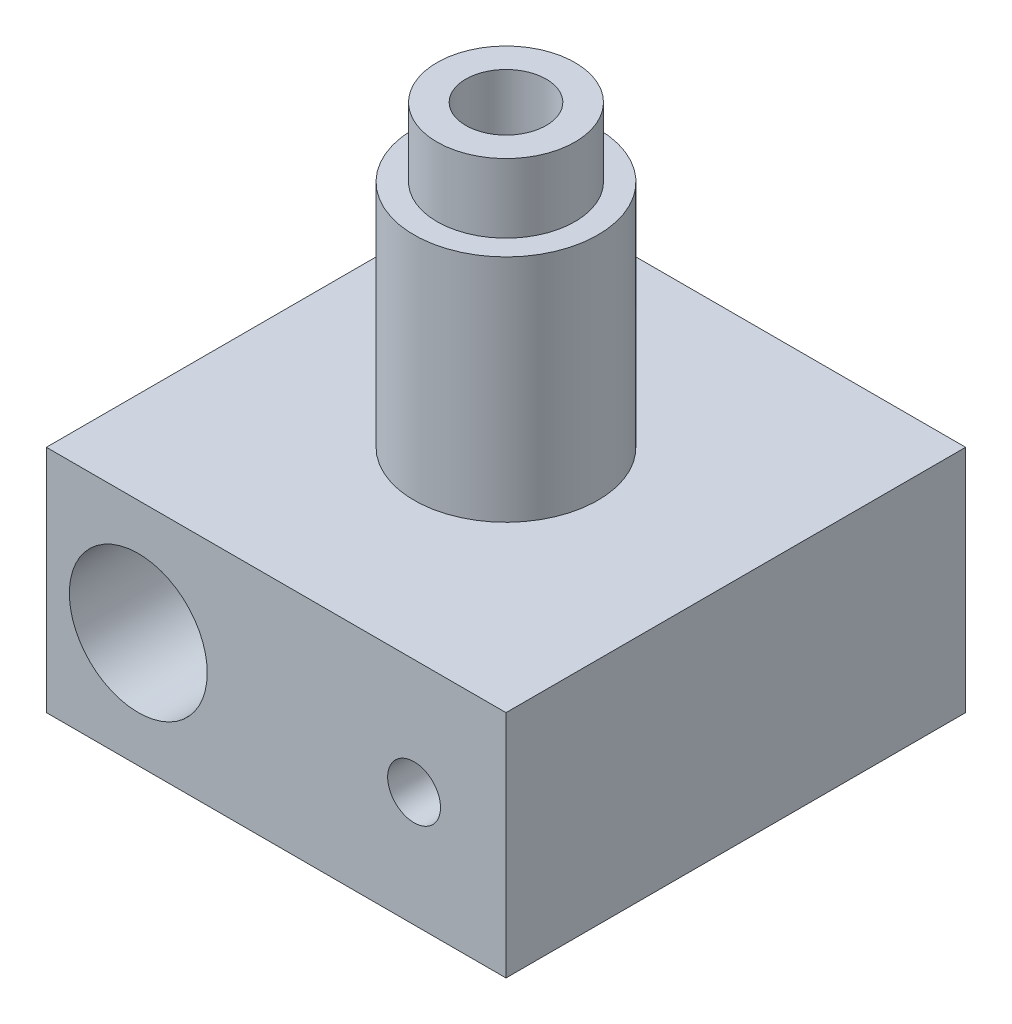
ISO-10303-21;
HEADER;
FILE_DESCRIPTION(('STEP AP214'),'2;1');
FILE_NAME('part.step','',(''),(''),'','','');
FILE_SCHEMA(('AUTOMOTIVE_DESIGN { 1 0 10303 214 1 1 1 1 }'));
ENDSEC;
DATA;
#1=APPLICATION_CONTEXT('core data for automotive mechanical design processes');
#2=APPLICATION_PROTOCOL_DEFINITION('international standard','automotive_design',2000,#1);
#3=PRODUCT_CONTEXT('',#1,'mechanical');
#4=PRODUCT('Part','Part','',(#3));
#5=PRODUCT_RELATED_PRODUCT_CATEGORY('part','',(#4));
#6=PRODUCT_DEFINITION_FORMATION('','',#4);
#7=PRODUCT_DEFINITION_CONTEXT('part definition',#1,'design');
#8=PRODUCT_DEFINITION('design','',#6,#7);
#9=PRODUCT_DEFINITION_SHAPE('','',#8);
#10=(LENGTH_UNIT() NAMED_UNIT(*) SI_UNIT(.MILLI.,.METRE.));
#11=(NAMED_UNIT(*) PLANE_ANGLE_UNIT() SI_UNIT($,.RADIAN.));
#12=(NAMED_UNIT(*) SI_UNIT($,.STERADIAN.) SOLID_ANGLE_UNIT());
#13=UNCERTAINTY_MEASURE_WITH_UNIT(LENGTH_MEASURE(1.E-05),#10,'distance_accuracy_value','');
#14=(GEOMETRIC_REPRESENTATION_CONTEXT(3) GLOBAL_UNCERTAINTY_ASSIGNED_CONTEXT((#13)) GLOBAL_UNIT_ASSIGNED_CONTEXT((#10,
#11,#12)) REPRESENTATION_CONTEXT('',''));
#15=CARTESIAN_POINT('',(0.,0.,0.));
#16=DIRECTION('',(0.,0.,1.));
#17=DIRECTION('',(1.,0.,0.));
#18=AXIS2_PLACEMENT_3D('',#15,#16,#17);
#19=CARTESIAN_POINT('',(0.,23.,0.));
#20=DIRECTION('',(0.,1.,0.));
#21=DIRECTION('',(0.,0.,1.));
#22=AXIS2_PLACEMENT_3D('',#19,#20,#21);
#23=PLANE('',#22);
#24=CARTESIAN_POINT('',(0.,23.,0.));
#25=DIRECTION('',(0.,1.,0.));
#26=DIRECTION('',(1.,0.,0.));
#27=AXIS2_PLACEMENT_3D('',#24,#25,#26);
#28=CIRCLE('',#27,1.75);
#29=CARTESIAN_POINT('',(0.,23.,-1.75));
#30=VERTEX_POINT('',#29);
#31=EDGE_CURVE('E162',#30,#30,#28,.T.);
#32=ORIENTED_EDGE('',*,*,#31,.F.);
#33=EDGE_LOOP('',(#32));
#34=FACE_BOUND('',#33,.T.);
#35=CARTESIAN_POINT('',(0.,23.,0.));
#36=DIRECTION('',(0.,1.,0.));
#37=DIRECTION('',(0.,0.,1.));
#38=AXIS2_PLACEMENT_3D('',#35,#36,#37);
#39=CIRCLE('',#38,3.);
#40=CARTESIAN_POINT('',(0.,23.,3.));
#41=VERTEX_POINT('',#40);
#42=EDGE_CURVE('E239',#41,#41,#39,.T.);
#43=ORIENTED_EDGE('',*,*,#42,.T.);
#44=EDGE_LOOP('',(#43));
#45=FACE_BOUND('',#44,.T.);
#46=ADVANCED_FACE('F47',(#34,#45),#23,.T.);
#47=CARTESIAN_POINT('',(0.,23.,0.));
#48=DIRECTION('',(0.,-1.,0.));
#49=DIRECTION('',(0.,0.,-1.));
#50=AXIS2_PLACEMENT_3D('',#47,#48,#49);
#51=CYLINDRICAL_SURFACE('',#50,4.);
#52=CARTESIAN_POINT('',(0.,10.,0.));
#53=DIRECTION('',(0.,1.,0.));
#54=DIRECTION('',(0.,0.,1.));
#55=AXIS2_PLACEMENT_3D('',#52,#53,#54);
#56=CIRCLE('',#55,4.);
#57=CARTESIAN_POINT('',(0.,10.,-4.));
#58=VERTEX_POINT('',#57);
#59=EDGE_CURVE('E165',#58,#58,#56,.T.);
#60=CARTESIAN_POINT('',(0.,20.,0.));
#61=DIRECTION('',(0.,1.,0.));
#62=DIRECTION('',(0.,0.,1.));
#63=AXIS2_PLACEMENT_3D('',#60,#61,#62);
#64=CIRCLE('',#63,4.);
#65=CARTESIAN_POINT('',(0.,20.,-4.));
#66=VERTEX_POINT('',#65);
#67=EDGE_CURVE('E51',#66,#66,#64,.T.);
#68=CARTESIAN_POINT('',(0.,10.,-4.));
#69=CARTESIAN_POINT('',(0.,10.1041666666667,-4.));
#70=CARTESIAN_POINT('',(0.,10.2083333333333,-4.));
#71=CARTESIAN_POINT('',(0.,10.4166666666667,-4.));
#72=CARTESIAN_POINT('',(0.,10.5208333333333,-4.));
#73=CARTESIAN_POINT('',(0.,10.7291666666667,-4.));
#74=CARTESIAN_POINT('',(0.,10.8333333333333,-4.));
#75=CARTESIAN_POINT('',(0.,11.0416666666667,-4.));
#76=CARTESIAN_POINT('',(0.,11.1458333333333,-4.));
#77=CARTESIAN_POINT('',(0.,11.3541666666667,-4.));
#78=CARTESIAN_POINT('',(0.,11.4583333333333,-4.));
#79=CARTESIAN_POINT('',(0.,11.6666666666667,-4.));
#80=CARTESIAN_POINT('',(0.,11.7708333333333,-4.));
#81=CARTESIAN_POINT('',(0.,11.9791666666667,-4.));
#82=CARTESIAN_POINT('',(0.,12.0833333333333,-4.));
#83=CARTESIAN_POINT('',(0.,12.2916666666667,-4.));
#84=CARTESIAN_POINT('',(0.,12.3958333333333,-4.));
#85=CARTESIAN_POINT('',(0.,12.6041666666667,-4.));
#86=CARTESIAN_POINT('',(0.,12.7083333333333,-4.));
#87=CARTESIAN_POINT('',(0.,12.9166666666667,-4.));
#88=CARTESIAN_POINT('',(0.,13.0208333333333,-4.));
#89=CARTESIAN_POINT('',(0.,13.2291666666667,-4.));
#90=CARTESIAN_POINT('',(0.,13.3333333333333,-4.));
#91=CARTESIAN_POINT('',(0.,13.5416666666667,-4.));
#92=CARTESIAN_POINT('',(0.,13.6458333333333,-4.));
#93=CARTESIAN_POINT('',(0.,13.8541666666667,-4.));
#94=CARTESIAN_POINT('',(0.,13.9583333333333,-4.));
#95=CARTESIAN_POINT('',(0.,14.1666666666667,-4.));
#96=CARTESIAN_POINT('',(0.,14.2708333333333,-4.));
#97=CARTESIAN_POINT('',(0.,14.4791666666667,-4.));
#98=CARTESIAN_POINT('',(0.,14.5833333333333,-4.));
#99=CARTESIAN_POINT('',(0.,14.7916666666667,-4.));
#100=CARTESIAN_POINT('',(0.,14.8958333333333,-4.));
#101=CARTESIAN_POINT('',(0.,15.1041666666667,-4.));
#102=CARTESIAN_POINT('',(0.,15.2083333333333,-4.));
#103=CARTESIAN_POINT('',(0.,15.4166666666667,-4.));
#104=CARTESIAN_POINT('',(0.,15.5208333333333,-4.));
#105=CARTESIAN_POINT('',(0.,15.7291666666667,-4.));
#106=CARTESIAN_POINT('',(0.,15.8333333333333,-4.));
#107=CARTESIAN_POINT('',(0.,16.0416666666667,-4.));
#108=CARTESIAN_POINT('',(0.,16.1458333333333,-4.));
#109=CARTESIAN_POINT('',(0.,16.3541666666667,-4.));
#110=CARTESIAN_POINT('',(0.,16.4583333333333,-4.));
#111=CARTESIAN_POINT('',(0.,16.6666666666667,-4.));
#112=CARTESIAN_POINT('',(0.,16.7708333333333,-4.));
#113=CARTESIAN_POINT('',(0.,16.9791666666667,-4.));
#114=CARTESIAN_POINT('',(0.,17.0833333333333,-4.));
#115=CARTESIAN_POINT('',(0.,17.2916666666667,-4.));
#116=CARTESIAN_POINT('',(0.,17.3958333333333,-4.));
#117=CARTESIAN_POINT('',(0.,17.6041666666667,-4.));
#118=CARTESIAN_POINT('',(0.,17.7083333333333,-4.));
#119=CARTESIAN_POINT('',(0.,17.9166666666667,-4.));
#120=CARTESIAN_POINT('',(0.,18.0208333333333,-4.));
#121=CARTESIAN_POINT('',(0.,18.2291666666667,-4.));
#122=CARTESIAN_POINT('',(0.,18.3333333333333,-4.));
#123=CARTESIAN_POINT('',(0.,18.5416666666667,-4.));
#124=CARTESIAN_POINT('',(0.,18.6458333333333,-4.));
#125=CARTESIAN_POINT('',(0.,18.8541666666667,-4.));
#126=CARTESIAN_POINT('',(0.,18.9583333333333,-4.));
#127=CARTESIAN_POINT('',(0.,19.1666666666667,-4.));
#128=CARTESIAN_POINT('',(0.,19.2708333333333,-4.));
#129=CARTESIAN_POINT('',(0.,19.4791666666667,-4.));
#130=CARTESIAN_POINT('',(0.,19.5833333333333,-4.));
#131=CARTESIAN_POINT('',(0.,19.7916666666667,-4.));
#132=CARTESIAN_POINT('',(0.,19.8958333333333,-4.));
#133=CARTESIAN_POINT('',(0.,20.,-4.));
#134=B_SPLINE_CURVE_WITH_KNOTS('',3,(#68,#69,#70,#71,#72,#73,#74,#75,#76,#77,#78,#79,#80,#81,
#82,#83,#84,#85,#86,#87,#88,#89,#90,#91,#92,#93,#94,#95,#96,#97,#98,#99,#100,#101,#102,#103,
#104,#105,#106,#107,#108,#109,#110,#111,#112,#113,#114,#115,#116,#117,#118,#119,#120,#121,#122,
#123,#124,#125,#126,#127,#128,#129,#130,#131,#132,#133),.UNSPECIFIED.,.F.,.F.,(4,2,2,2,2,2,2,2,
2,2,2,2,2,2,2,2,2,2,2,2,2,2,2,2,2,2,2,2,2,2,2,2,4),(0.,0.3125,0.625000000000001,
0.937500000000001,1.25,1.5625,1.875,2.1875,2.5,2.8125,3.125,3.4375,3.75,4.0625,4.375,4.6875,5.,
5.3125,5.625,5.9375,6.25,6.5625,6.875,7.1875,7.5,7.8125,8.125,8.4375,8.75,9.0625,9.375,9.6875,
10.),.UNSPECIFIED.);
#135=EDGE_CURVE('BSEAM190',#58,#66,#134,.T.);
#136=ORIENTED_EDGE('',*,*,#59,.T.);
#137=ORIENTED_EDGE('',*,*,#67,.F.);
#138=ORIENTED_EDGE('',*,*,#135,.T.);
#139=ORIENTED_EDGE('',*,*,#135,.F.);
#140=EDGE_LOOP('',(#136,#138,#137,#139));
#141=FACE_BOUND('',#140,.T.);
#142=ADVANCED_FACE('F190',(#141),#51,.T.);
#143=CARTESIAN_POINT('',(0.,10.,0.));
#144=DIRECTION('',(0.,1.,0.));
#145=DIRECTION('',(0.,0.,1.));
#146=AXIS2_PLACEMENT_3D('',#143,#144,#145);
#147=PLANE('',#146);
#148=DIRECTION('',(0.,0.,1.));
#149=VECTOR('',#148,1.);
#150=CARTESIAN_POINT('',(-10.,10.,10.));
#151=LINE('',#150,#149);
#152=CARTESIAN_POINT('',(-10.,10.,-10.));
#153=VERTEX_POINT('',#152);
#154=CARTESIAN_POINT('',(-10.,10.,10.));
#155=VERTEX_POINT('',#154);
#156=EDGE_CURVE('E103',#153,#155,#151,.T.);
#157=ORIENTED_EDGE('',*,*,#156,.T.);
#158=DIRECTION('',(1.,0.,0.));
#159=VECTOR('',#158,1.);
#160=CARTESIAN_POINT('',(10.,10.,10.));
#161=LINE('',#160,#159);
#162=CARTESIAN_POINT('',(10.,10.,10.));
#163=VERTEX_POINT('',#162);
#164=EDGE_CURVE('E97',#155,#163,#161,.T.);
#165=ORIENTED_EDGE('',*,*,#164,.T.);
#166=DIRECTION('',(0.,0.,-1.));
#167=VECTOR('',#166,1.);
#168=CARTESIAN_POINT('',(10.,10.,10.));
#169=LINE('',#168,#167);
#170=CARTESIAN_POINT('',(10.,10.,-10.));
#171=VERTEX_POINT('',#170);
#172=EDGE_CURVE('E101',#163,#171,#169,.T.);
#173=ORIENTED_EDGE('',*,*,#172,.T.);
#174=DIRECTION('',(-1.,0.,0.));
#175=VECTOR('',#174,1.);
#176=CARTESIAN_POINT('',(10.,10.,-10.));
#177=LINE('',#176,#175);
#178=EDGE_CURVE('E66',#171,#153,#177,.T.);
#179=ORIENTED_EDGE('',*,*,#178,.T.);
#180=EDGE_LOOP('',(#157,#165,#173,#179));
#181=FACE_BOUND('',#180,.T.);
#182=ORIENTED_EDGE('',*,*,#59,.F.);
#183=EDGE_LOOP('',(#182));
#184=FACE_BOUND('',#183,.T.);
#185=ADVANCED_FACE('F98',(#181,#184),#147,.T.);
#186=CARTESIAN_POINT('',(0.,-26.5281717356203,0.));
#187=DIRECTION('',(0.,-1.,0.));
#188=DIRECTION('',(0.,0.,-1.));
#189=AXIS2_PLACEMENT_3D('',#186,#187,#188);
#190=CYLINDRICAL_SURFACE('',#189,0.15);
#191=CARTESIAN_POINT('',(0.,-5.,0.));
#192=DIRECTION('',(0.,-1.,0.));
#193=DIRECTION('',(0.,0.,-1.));
#194=AXIS2_PLACEMENT_3D('',#191,#192,#193);
#195=CIRCLE('',#194,0.149999999999999);
#196=CARTESIAN_POINT('',(0.,-5.,-0.149999999999999));
#197=VERTEX_POINT('',#196);
#198=EDGE_CURVE('E57',#197,#197,#195,.T.);
#199=ORIENTED_EDGE('',*,*,#198,.T.);
#200=EDGE_LOOP('',(#199));
#201=FACE_BOUND('',#200,.T.);
#202=CARTESIAN_POINT('',(0.,10.,0.));
#203=DIRECTION('',(0.,1.,0.));
#204=DIRECTION('',(0.,0.,1.));
#205=AXIS2_PLACEMENT_3D('',#202,#203,#204);
#206=CIRCLE('',#205,0.150000000000001);
#207=CARTESIAN_POINT('',(0.,10.,0.150000000000001));
#208=VERTEX_POINT('',#207);
#209=EDGE_CURVE('E121',#208,#208,#206,.T.);
#210=ORIENTED_EDGE('',*,*,#209,.T.);
#211=EDGE_LOOP('',(#210));
#212=FACE_BOUND('',#211,.T.);
#213=ADVANCED_FACE('F49',(#201,#212),#190,.F.);
#214=CARTESIAN_POINT('',(-0.149999999999999,-5.,0.));
#215=DIRECTION('',(0.,1.,0.));
#216=DIRECTION('',(0.,0.,1.));
#217=AXIS2_PLACEMENT_3D('',#214,#215,#216);
#218=PLANE('',#217);
#219=ORIENTED_EDGE('',*,*,#198,.F.);
#220=EDGE_LOOP('',(#219));
#221=FACE_BOUND('',#220,.T.);
#222=CARTESIAN_POINT('',(0.,-5.,0.));
#223=DIRECTION('',(0.,-1.,0.));
#224=DIRECTION('',(0.,0.,-1.));
#225=AXIS2_PLACEMENT_3D('',#222,#223,#224);
#226=CIRCLE('',#225,0.5);
#227=CARTESIAN_POINT('',(0.,-5.,0.5));
#228=VERTEX_POINT('',#227);
#229=EDGE_CURVE('E134',#228,#228,#226,.T.);
#230=ORIENTED_EDGE('',*,*,#229,.T.);
#231=EDGE_LOOP('',(#230));
#232=FACE_BOUND('',#231,.T.);
#233=ADVANCED_FACE('F268',(#221,#232),#218,.F.);
#234=CARTESIAN_POINT('',(0.,-2.,0.));
#235=DIRECTION('',(0.,1.,0.));
#236=DIRECTION('',(0.,0.,1.));
#237=AXIS2_PLACEMENT_3D('',#234,#235,#236);
#238=CONICAL_SURFACE('',#237,3.,0.694738276196703);
#239=CARTESIAN_POINT('',(0.,-2.,0.));
#240=DIRECTION('',(0.,-1.,0.));
#241=DIRECTION('',(0.,0.,-1.));
#242=AXIS2_PLACEMENT_3D('',#239,#240,#241);
#243=CIRCLE('',#242,3.);
#244=CARTESIAN_POINT('',(0.,-2.,3.));
#245=VERTEX_POINT('',#244);
#246=EDGE_CURVE('E131',#245,#245,#243,.T.);
#247=CARTESIAN_POINT('',(0.,-5.,0.5));
#248=CARTESIAN_POINT('',(0.,-4.96875,0.526041666666667));
#249=CARTESIAN_POINT('',(0.,-4.9375,0.552083333333334));
#250=CARTESIAN_POINT('',(0.,-4.875,0.604166666666667));
#251=CARTESIAN_POINT('',(0.,-4.84375,0.630208333333334));
#252=CARTESIAN_POINT('',(0.,-4.78125,0.682291666666667));
#253=CARTESIAN_POINT('',(0.,-4.75,0.708333333333333));
#254=CARTESIAN_POINT('',(0.,-4.6875,0.760416666666667));
#255=CARTESIAN_POINT('',(0.,-4.65625,0.786458333333334));
#256=CARTESIAN_POINT('',(0.,-4.59375,0.838541666666667));
#257=CARTESIAN_POINT('',(0.,-4.5625,0.864583333333334));
#258=CARTESIAN_POINT('',(0.,-4.5,0.916666666666667));
#259=CARTESIAN_POINT('',(0.,-4.46875,0.942708333333334));
#260=CARTESIAN_POINT('',(0.,-4.40625,0.994791666666667));
#261=CARTESIAN_POINT('',(0.,-4.375,1.02083333333333));
#262=CARTESIAN_POINT('',(0.,-4.3125,1.07291666666667));
#263=CARTESIAN_POINT('',(0.,-4.28125,1.09895833333333));
#264=CARTESIAN_POINT('',(0.,-4.21875,1.15104166666667));
#265=CARTESIAN_POINT('',(0.,-4.1875,1.17708333333333));
#266=CARTESIAN_POINT('',(0.,-4.125,1.22916666666667));
#267=CARTESIAN_POINT('',(0.,-4.09375,1.25520833333333));
#268=CARTESIAN_POINT('',(0.,-4.03125,1.30729166666667));
#269=CARTESIAN_POINT('',(0.,-4.,1.33333333333333));
#270=CARTESIAN_POINT('',(0.,-3.9375,1.38541666666667));
#271=CARTESIAN_POINT('',(0.,-3.90625,1.41145833333333));
#272=CARTESIAN_POINT('',(0.,-3.84375,1.46354166666667));
#273=CARTESIAN_POINT('',(0.,-3.8125,1.48958333333333));
#274=CARTESIAN_POINT('',(0.,-3.75,1.54166666666667));
#275=CARTESIAN_POINT('',(0.,-3.71875,1.56770833333333));
#276=CARTESIAN_POINT('',(0.,-3.65625,1.61979166666667));
#277=CARTESIAN_POINT('',(0.,-3.625,1.64583333333333));
#278=CARTESIAN_POINT('',(0.,-3.5625,1.69791666666667));
#279=CARTESIAN_POINT('',(0.,-3.53125,1.72395833333333));
#280=CARTESIAN_POINT('',(0.,-3.46875,1.77604166666667));
#281=CARTESIAN_POINT('',(0.,-3.4375,1.80208333333333));
#282=CARTESIAN_POINT('',(0.,-3.375,1.85416666666667));
#283=CARTESIAN_POINT('',(0.,-3.34375,1.88020833333333));
#284=CARTESIAN_POINT('',(0.,-3.28125,1.93229166666667));
#285=CARTESIAN_POINT('',(0.,-3.25,1.95833333333333));
#286=CARTESIAN_POINT('',(0.,-3.1875,2.01041666666667));
#287=CARTESIAN_POINT('',(0.,-3.15625,2.03645833333333));
#288=CARTESIAN_POINT('',(0.,-3.09375,2.08854166666667));
#289=CARTESIAN_POINT('',(0.,-3.0625,2.11458333333333));
#290=CARTESIAN_POINT('',(0.,-3.,2.16666666666667));
#291=CARTESIAN_POINT('',(0.,-2.96875,2.19270833333333));
#292=CARTESIAN_POINT('',(0.,-2.90625,2.24479166666667));
#293=CARTESIAN_POINT('',(0.,-2.875,2.27083333333333));
#294=CARTESIAN_POINT('',(0.,-2.8125,2.32291666666667));
#295=CARTESIAN_POINT('',(0.,-2.78125,2.34895833333333));
#296=CARTESIAN_POINT('',(0.,-2.71875,2.40104166666667));
#297=CARTESIAN_POINT('',(0.,-2.6875,2.42708333333333));
#298=CARTESIAN_POINT('',(0.,-2.625,2.47916666666667));
#299=CARTESIAN_POINT('',(0.,-2.59375,2.50520833333333));
#300=CARTESIAN_POINT('',(0.,-2.53125,2.55729166666667));
#301=CARTESIAN_POINT('',(0.,-2.5,2.58333333333333));
#302=CARTESIAN_POINT('',(0.,-2.4375,2.63541666666667));
#303=CARTESIAN_POINT('',(0.,-2.40625,2.66145833333333));
#304=CARTESIAN_POINT('',(0.,-2.34375,2.71354166666667));
#305=CARTESIAN_POINT('',(0.,-2.3125,2.73958333333333));
#306=CARTESIAN_POINT('',(0.,-2.25,2.79166666666667));
#307=CARTESIAN_POINT('',(0.,-2.21875,2.81770833333333));
#308=CARTESIAN_POINT('',(0.,-2.15625,2.86979166666667));
#309=CARTESIAN_POINT('',(0.,-2.125,2.89583333333333));
#310=CARTESIAN_POINT('',(0.,-2.0625,2.94791666666667));
#311=CARTESIAN_POINT('',(0.,-2.03125,2.97395833333333));
#312=CARTESIAN_POINT('',(0.,-2.,3.));
#313=B_SPLINE_CURVE_WITH_KNOTS('',3,(#247,#248,#249,#250,#251,#252,#253,#254,#255,#256,#257,
#258,#259,#260,#261,#262,#263,#264,#265,#266,#267,#268,#269,#270,#271,#272,#273,#274,#275,#276,
#277,#278,#279,#280,#281,#282,#283,#284,#285,#286,#287,#288,#289,#290,#291,#292,#293,#294,#295,
#296,#297,#298,#299,#300,#301,#302,#303,#304,#305,#306,#307,#308,#309,#310,#311,#312),
.UNSPECIFIED.,.F.,.F.,(4,2,2,2,2,2,2,2,2,2,2,2,2,2,2,2,2,2,2,2,2,2,2,2,2,2,2,2,2,2,2,2,4),(0.,
0.122035151186042,0.244070302372082,0.366105453558124,0.488140604744165,0.610175755930207,
0.732210907116249,0.85424605830229,0.976281209488332,1.09831636067437,1.22035151186041,
1.34238666304646,1.4644218142325,1.58645696541854,1.70849211660458,1.83052726779062,
1.95256241897666,2.0745975701627,2.19663272134874,2.31866787253479,2.44070302372083,
2.56273817490687,2.68477332609291,2.80680847727895,2.92884362846499,3.05087877965103,
3.17291393083708,3.29494908202312,3.41698423320916,3.5390193843952,3.66105453558124,
3.78308968676728,3.90512483795332),.UNSPECIFIED.);
#314=EDGE_CURVE('BSEAM265',#228,#245,#313,.T.);
#315=ORIENTED_EDGE('',*,*,#229,.F.);
#316=ORIENTED_EDGE('',*,*,#246,.T.);
#317=ORIENTED_EDGE('',*,*,#314,.T.);
#318=ORIENTED_EDGE('',*,*,#314,.F.);
#319=EDGE_LOOP('',(#315,#317,#316,#318));
#320=FACE_BOUND('',#319,.T.);
#321=ADVANCED_FACE('F265',(#320),#238,.T.);
#322=CARTESIAN_POINT('',(0.,-26.5281717356203,0.));
#323=DIRECTION('',(0.,-1.,0.));
#324=DIRECTION('',(0.,0.,-1.));
#325=AXIS2_PLACEMENT_3D('',#322,#323,#324);
#326=CYLINDRICAL_SURFACE('',#325,3.);
#327=ORIENTED_EDGE('',*,*,#246,.F.);
#328=EDGE_LOOP('',(#327));
#329=FACE_BOUND('',#328,.T.);
#330=CARTESIAN_POINT('',(0.,0.,0.));
#331=DIRECTION('',(0.,1.,0.));
#332=DIRECTION('',(0.,0.,1.));
#333=AXIS2_PLACEMENT_3D('',#330,#331,#332);
#334=CIRCLE('',#333,3.);
#335=CARTESIAN_POINT('',(0.,0.,3.));
#336=VERTEX_POINT('',#335);
#337=EDGE_CURVE('E128',#336,#336,#334,.T.);
#338=ORIENTED_EDGE('',*,*,#337,.F.);
#339=EDGE_LOOP('',(#338));
#340=FACE_BOUND('',#339,.T.);
#341=ADVANCED_FACE('F184',(#329,#340),#326,.T.);
#342=CARTESIAN_POINT('',(0.,0.,0.));
#343=DIRECTION('',(0.,1.,0.));
#344=DIRECTION('',(0.,0.,1.));
#345=AXIS2_PLACEMENT_3D('',#342,#343,#344);
#346=PLANE('',#345);
#347=DIRECTION('',(0.,0.,1.));
#348=VECTOR('',#347,1.);
#349=CARTESIAN_POINT('',(-10.,0.,10.));
#350=LINE('',#349,#348);
#351=CARTESIAN_POINT('',(-10.,0.,-10.));
#352=VERTEX_POINT('',#351);
#353=CARTESIAN_POINT('',(-10.,0.,10.));
#354=VERTEX_POINT('',#353);
#355=EDGE_CURVE('E118',#352,#354,#350,.T.);
#356=ORIENTED_EDGE('',*,*,#355,.F.);
#357=DIRECTION('',(-1.,0.,0.));
#358=VECTOR('',#357,1.);
#359=CARTESIAN_POINT('',(10.,0.,-10.));
#360=LINE('',#359,#358);
#361=CARTESIAN_POINT('',(10.,0.,-10.));
#362=VERTEX_POINT('',#361);
#363=EDGE_CURVE('E89',#362,#352,#360,.T.);
#364=ORIENTED_EDGE('',*,*,#363,.F.);
#365=DIRECTION('',(0.,0.,-1.));
#366=VECTOR('',#365,1.);
#367=CARTESIAN_POINT('',(10.,0.,10.));
#368=LINE('',#367,#366);
#369=CARTESIAN_POINT('',(10.,0.,10.));
#370=VERTEX_POINT('',#369);
#371=EDGE_CURVE('E83',#370,#362,#368,.T.);
#372=ORIENTED_EDGE('',*,*,#371,.F.);
#373=DIRECTION('',(1.,0.,0.));
#374=VECTOR('',#373,1.);
#375=CARTESIAN_POINT('',(10.,0.,10.));
#376=LINE('',#375,#374);
#377=EDGE_CURVE('E108',#354,#370,#376,.T.);
#378=ORIENTED_EDGE('',*,*,#377,.F.);
#379=EDGE_LOOP('',(#356,#364,#372,#378));
#380=FACE_BOUND('',#379,.T.);
#381=ORIENTED_EDGE('',*,*,#337,.T.);
#382=EDGE_LOOP('',(#381));
#383=FACE_BOUND('',#382,.T.);
#384=ADVANCED_FACE('F175',(#380,#383),#346,.F.);
#385=CARTESIAN_POINT('',(0.,10.,0.));
#386=DIRECTION('',(0.,1.,0.));
#387=DIRECTION('',(0.,0.,1.));
#388=AXIS2_PLACEMENT_3D('',#385,#386,#387);
#389=CIRCLE('',#388,1.75);
#390=CARTESIAN_POINT('',(0.,10.,-1.75));
#391=VERTEX_POINT('',#390);
#392=EDGE_CURVE('E12',#391,#391,#389,.F.);
#393=ORIENTED_EDGE('',*,*,#392,.F.);
#394=EDGE_LOOP('',(#393));
#395=FACE_BOUND('',#394,.T.);
#396=ORIENTED_EDGE('',*,*,#209,.F.);
#397=EDGE_LOOP('',(#396));
#398=FACE_BOUND('',#397,.T.);
#399=ADVANCED_FACE('F172',(#395,#398),#147,.T.);
#400=CARTESIAN_POINT('',(-10.,10.,10.));
#401=DIRECTION('',(1.,0.,0.));
#402=DIRECTION('',(0.,0.,-1.));
#403=AXIS2_PLACEMENT_3D('',#400,#401,#402);
#404=PLANE('',#403);
#405=ORIENTED_EDGE('',*,*,#355,.T.);
#406=DIRECTION('',(0.,-1.,0.));
#407=VECTOR('',#406,1.);
#408=CARTESIAN_POINT('',(-10.,10.,10.));
#409=LINE('',#408,#407);
#410=EDGE_CURVE('E109',#155,#354,#409,.T.);
#411=ORIENTED_EDGE('',*,*,#410,.F.);
#412=ORIENTED_EDGE('',*,*,#156,.F.);
#413=DIRECTION('',(0.,-1.,0.));
#414=VECTOR('',#413,1.);
#415=CARTESIAN_POINT('',(-10.,10.,-10.));
#416=LINE('',#415,#414);
#417=EDGE_CURVE('E114',#153,#352,#416,.T.);
#418=ORIENTED_EDGE('',*,*,#417,.T.);
#419=EDGE_LOOP('',(#405,#411,#412,#418));
#420=FACE_BOUND('',#419,.T.);
#421=ADVANCED_FACE('F174',(#420),#404,.F.);
#422=CARTESIAN_POINT('',(10.,10.,10.));
#423=DIRECTION('',(0.,0.,-1.));
#424=DIRECTION('',(-1.,0.,0.));
#425=AXIS2_PLACEMENT_3D('',#422,#423,#424);
#426=PLANE('',#425);
#427=CARTESIAN_POINT('',(6.,5.,10.));
#428=DIRECTION('',(0.,0.,1.));
#429=DIRECTION('',(1.,0.,0.));
#430=AXIS2_PLACEMENT_3D('',#427,#428,#429);
#431=CIRCLE('',#430,1.15);
#432=CARTESIAN_POINT('',(7.15,5.,10.));
#433=VERTEX_POINT('',#432);
#434=EDGE_CURVE('E140',#433,#433,#431,.T.);
#435=ORIENTED_EDGE('',*,*,#434,.F.);
#436=EDGE_LOOP('',(#435));
#437=FACE_BOUND('',#436,.T.);
#438=CARTESIAN_POINT('',(-6.,5.,10.));
#439=DIRECTION('',(0.,0.,1.));
#440=DIRECTION('',(1.,0.,0.));
#441=AXIS2_PLACEMENT_3D('',#438,#439,#440);
#442=CIRCLE('',#441,3.);
#443=CARTESIAN_POINT('',(-3.,5.,10.));
#444=VERTEX_POINT('',#443);
#445=EDGE_CURVE('E145',#444,#444,#442,.T.);
#446=ORIENTED_EDGE('',*,*,#445,.F.);
#447=EDGE_LOOP('',(#446));
#448=FACE_BOUND('',#447,.T.);
#449=ORIENTED_EDGE('',*,*,#377,.T.);
#450=DIRECTION('',(0.,-1.,0.));
#451=VECTOR('',#450,1.);
#452=CARTESIAN_POINT('',(10.,10.,10.));
#453=LINE('',#452,#451);
#454=EDGE_CURVE('E106',#163,#370,#453,.T.);
#455=ORIENTED_EDGE('',*,*,#454,.F.);
#456=ORIENTED_EDGE('',*,*,#164,.F.);
#457=ORIENTED_EDGE('',*,*,#410,.T.);
#458=EDGE_LOOP('',(#449,#455,#456,#457));
#459=FACE_BOUND('',#458,.T.);
#460=ADVANCED_FACE('F107',(#437,#448,#459),#426,.F.);
#461=CARTESIAN_POINT('',(10.,10.,10.));
#462=DIRECTION('',(-1.,0.,0.));
#463=DIRECTION('',(0.,0.,1.));
#464=AXIS2_PLACEMENT_3D('',#461,#462,#463);
#465=PLANE('',#464);
#466=ORIENTED_EDGE('',*,*,#371,.T.);
#467=DIRECTION('',(0.,-1.,0.));
#468=VECTOR('',#467,1.);
#469=CARTESIAN_POINT('',(10.,10.,-10.));
#470=LINE('',#469,#468);
#471=EDGE_CURVE('E110',#171,#362,#470,.T.);
#472=ORIENTED_EDGE('',*,*,#471,.F.);
#473=ORIENTED_EDGE('',*,*,#172,.F.);
#474=ORIENTED_EDGE('',*,*,#454,.T.);
#475=EDGE_LOOP('',(#466,#472,#473,#474));
#476=FACE_BOUND('',#475,.T.);
#477=ADVANCED_FACE('F112',(#476),#465,.F.);
#478=CARTESIAN_POINT('',(10.,10.,-10.));
#479=DIRECTION('',(0.,0.,1.));
#480=DIRECTION('',(1.,0.,0.));
#481=AXIS2_PLACEMENT_3D('',#478,#479,#480);
#482=PLANE('',#481);
#483=CARTESIAN_POINT('',(6.,5.,-10.));
#484=DIRECTION('',(0.,0.,-1.));
#485=DIRECTION('',(-1.,0.,0.));
#486=AXIS2_PLACEMENT_3D('',#483,#484,#485);
#487=CIRCLE('',#486,3.025);
#488=CARTESIAN_POINT('',(2.975,5.,-10.));
#489=VERTEX_POINT('',#488);
#490=EDGE_CURVE('E153',#489,#489,#487,.T.);
#491=ORIENTED_EDGE('',*,*,#490,.F.);
#492=EDGE_LOOP('',(#491));
#493=FACE_BOUND('',#492,.T.);
#494=CARTESIAN_POINT('',(-6.,5.,-10.));
#495=DIRECTION('',(0.,0.,1.));
#496=DIRECTION('',(1.,0.,0.));
#497=AXIS2_PLACEMENT_3D('',#494,#495,#496);
#498=CIRCLE('',#497,3.);
#499=CARTESIAN_POINT('',(-3.,5.,-10.));
#500=VERTEX_POINT('',#499);
#501=EDGE_CURVE('E159',#500,#500,#498,.F.);
#502=ORIENTED_EDGE('',*,*,#501,.F.);
#503=EDGE_LOOP('',(#502));
#504=FACE_BOUND('',#503,.T.);
#505=ORIENTED_EDGE('',*,*,#363,.T.);
#506=ORIENTED_EDGE('',*,*,#417,.F.);
#507=ORIENTED_EDGE('',*,*,#178,.F.);
#508=ORIENTED_EDGE('',*,*,#471,.T.);
#509=EDGE_LOOP('',(#505,#506,#507,#508));
#510=FACE_BOUND('',#509,.T.);
#511=ADVANCED_FACE('F205',(#493,#504,#510),#482,.F.);
#512=CARTESIAN_POINT('',(0.,23.,0.));
#513=DIRECTION('',(0.,-1.,0.));
#514=DIRECTION('',(0.,0.,-1.));
#515=AXIS2_PLACEMENT_3D('',#512,#513,#514);
#516=CYLINDRICAL_SURFACE('',#515,1.75);
#517=CARTESIAN_POINT('',(0.,23.,-1.75));
#518=CARTESIAN_POINT('',(0.,22.8645833333333,-1.75));
#519=CARTESIAN_POINT('',(0.,22.7291666666667,-1.75));
#520=CARTESIAN_POINT('',(0.,22.4583333333333,-1.75));
#521=CARTESIAN_POINT('',(0.,22.3229166666667,-1.75));
#522=CARTESIAN_POINT('',(0.,22.0520833333333,-1.75));
#523=CARTESIAN_POINT('',(0.,21.9166666666667,-1.75));
#524=CARTESIAN_POINT('',(0.,21.6458333333333,-1.75));
#525=CARTESIAN_POINT('',(0.,21.5104166666667,-1.75));
#526=CARTESIAN_POINT('',(0.,21.2395833333333,-1.75));
#527=CARTESIAN_POINT('',(0.,21.1041666666667,-1.75));
#528=CARTESIAN_POINT('',(0.,20.8333333333333,-1.75));
#529=CARTESIAN_POINT('',(0.,20.6979166666667,-1.75));
#530=CARTESIAN_POINT('',(0.,20.4270833333333,-1.75));
#531=CARTESIAN_POINT('',(0.,20.2916666666667,-1.75));
#532=CARTESIAN_POINT('',(0.,20.0208333333333,-1.75));
#533=CARTESIAN_POINT('',(0.,19.8854166666667,-1.75));
#534=CARTESIAN_POINT('',(0.,19.6145833333333,-1.75));
#535=CARTESIAN_POINT('',(0.,19.4791666666667,-1.75));
#536=CARTESIAN_POINT('',(0.,19.2083333333333,-1.75));
#537=CARTESIAN_POINT('',(0.,19.0729166666667,-1.75));
#538=CARTESIAN_POINT('',(0.,18.8020833333333,-1.75));
#539=CARTESIAN_POINT('',(0.,18.6666666666667,-1.75));
#540=CARTESIAN_POINT('',(0.,18.3958333333333,-1.75));
#541=CARTESIAN_POINT('',(0.,18.2604166666667,-1.75));
#542=CARTESIAN_POINT('',(0.,17.9895833333333,-1.75));
#543=CARTESIAN_POINT('',(0.,17.8541666666667,-1.75));
#544=CARTESIAN_POINT('',(0.,17.5833333333333,-1.75));
#545=CARTESIAN_POINT('',(0.,17.4479166666667,-1.75));
#546=CARTESIAN_POINT('',(0.,17.1770833333333,-1.75));
#547=CARTESIAN_POINT('',(0.,17.0416666666667,-1.75));
#548=CARTESIAN_POINT('',(0.,16.7708333333333,-1.75));
#549=CARTESIAN_POINT('',(0.,16.6354166666667,-1.75));
#550=CARTESIAN_POINT('',(0.,16.3645833333333,-1.75));
#551=CARTESIAN_POINT('',(0.,16.2291666666667,-1.75));
#552=CARTESIAN_POINT('',(0.,15.9583333333333,-1.75));
#553=CARTESIAN_POINT('',(0.,15.8229166666667,-1.75));
#554=CARTESIAN_POINT('',(0.,15.5520833333333,-1.75));
#555=CARTESIAN_POINT('',(0.,15.4166666666667,-1.75));
#556=CARTESIAN_POINT('',(0.,15.1458333333333,-1.75));
#557=CARTESIAN_POINT('',(0.,15.0104166666667,-1.75));
#558=CARTESIAN_POINT('',(0.,14.7395833333333,-1.75));
#559=CARTESIAN_POINT('',(0.,14.6041666666667,-1.75));
#560=CARTESIAN_POINT('',(0.,14.3333333333333,-1.75));
#561=CARTESIAN_POINT('',(0.,14.1979166666667,-1.75));
#562=CARTESIAN_POINT('',(0.,13.9270833333333,-1.75));
#563=CARTESIAN_POINT('',(0.,13.7916666666667,-1.75));
#564=CARTESIAN_POINT('',(0.,13.5208333333333,-1.75));
#565=CARTESIAN_POINT('',(0.,13.3854166666667,-1.75));
#566=CARTESIAN_POINT('',(0.,13.1145833333333,-1.75));
#567=CARTESIAN_POINT('',(0.,12.9791666666667,-1.75));
#568=CARTESIAN_POINT('',(0.,12.7083333333333,-1.75));
#569=CARTESIAN_POINT('',(0.,12.5729166666667,-1.75));
#570=CARTESIAN_POINT('',(0.,12.3020833333333,-1.75));
#571=CARTESIAN_POINT('',(0.,12.1666666666667,-1.75));
#572=CARTESIAN_POINT('',(0.,11.8958333333333,-1.75));
#573=CARTESIAN_POINT('',(0.,11.7604166666667,-1.75));
#574=CARTESIAN_POINT('',(0.,11.4895833333333,-1.75));
#575=CARTESIAN_POINT('',(0.,11.3541666666667,-1.75));
#576=CARTESIAN_POINT('',(0.,11.0833333333333,-1.75));
#577=CARTESIAN_POINT('',(0.,10.9479166666667,-1.75));
#578=CARTESIAN_POINT('',(0.,10.6770833333333,-1.75));
#579=CARTESIAN_POINT('',(0.,10.5416666666667,-1.75));
#580=CARTESIAN_POINT('',(0.,10.2708333333333,-1.75));
#581=CARTESIAN_POINT('',(0.,10.1354166666667,-1.75));
#582=CARTESIAN_POINT('',(0.,10.,-1.75));
#583=B_SPLINE_CURVE_WITH_KNOTS('',3,(#517,#518,#519,#520,#521,#522,#523,#524,#525,#526,#527,
#528,#529,#530,#531,#532,#533,#534,#535,#536,#537,#538,#539,#540,#541,#542,#543,#544,#545,#546,
#547,#548,#549,#550,#551,#552,#553,#554,#555,#556,#557,#558,#559,#560,#561,#562,#563,#564,#565,
#566,#567,#568,#569,#570,#571,#572,#573,#574,#575,#576,#577,#578,#579,#580,#581,#582),
.UNSPECIFIED.,.F.,.F.,(4,2,2,2,2,2,2,2,2,2,2,2,2,2,2,2,2,2,2,2,2,2,2,2,2,2,2,2,2,2,2,2,4),(0.,
0.40625,0.812500000000001,1.21875,1.625,2.03125,2.4375,2.84375,3.25,3.65625,4.0625,4.46875,
4.875,5.28125,5.6875,6.09375,6.5,6.90625,7.3125,7.71875,8.125,8.53125,8.9375,9.34375,9.75,
10.15625,10.5625,10.96875,11.375,11.78125,12.1875,12.59375,13.),.UNSPECIFIED.);
#584=EDGE_CURVE('BSEAM201',#30,#391,#583,.T.);
#585=ORIENTED_EDGE('',*,*,#31,.T.);
#586=ORIENTED_EDGE('',*,*,#392,.T.);
#587=ORIENTED_EDGE('',*,*,#584,.T.);
#588=ORIENTED_EDGE('',*,*,#584,.F.);
#589=EDGE_LOOP('',(#585,#587,#586,#588));
#590=FACE_BOUND('',#589,.T.);
#591=ADVANCED_FACE('F201',(#590),#516,.F.);
#592=CARTESIAN_POINT('',(-6.,5.,-10.001));
#593=DIRECTION('',(0.,0.,1.));
#594=DIRECTION('',(1.,0.,0.));
#595=AXIS2_PLACEMENT_3D('',#592,#593,#594);
#596=CYLINDRICAL_SURFACE('',#595,3.);
#597=ORIENTED_EDGE('',*,*,#445,.T.);
#598=EDGE_LOOP('',(#597));
#599=FACE_BOUND('',#598,.T.);
#600=ORIENTED_EDGE('',*,*,#501,.T.);
#601=EDGE_LOOP('',(#600));
#602=FACE_BOUND('',#601,.T.);
#603=ADVANCED_FACE('F204',(#599,#602),#596,.F.);
#604=CARTESIAN_POINT('',(6.,5.,-10.001));
#605=DIRECTION('',(0.,0.,1.));
#606=DIRECTION('',(1.,0.,0.));
#607=AXIS2_PLACEMENT_3D('',#604,#605,#606);
#608=CYLINDRICAL_SURFACE('',#607,1.15);
#609=CARTESIAN_POINT('',(6.,5.,2.8111618356872));
#610=DIRECTION('',(0.,0.,-1.));
#611=DIRECTION('',(-1.,0.,0.));
#612=AXIS2_PLACEMENT_3D('',#609,#610,#611);
#613=CIRCLE('',#612,1.15);
#614=CARTESIAN_POINT('',(4.85,5.,2.8111618356872));
#615=VERTEX_POINT('',#614);
#616=EDGE_CURVE('E138',#615,#615,#613,.T.);
#617=ORIENTED_EDGE('',*,*,#616,.T.);
#618=EDGE_LOOP('',(#617));
#619=FACE_BOUND('',#618,.T.);
#620=ORIENTED_EDGE('',*,*,#434,.T.);
#621=EDGE_LOOP('',(#620));
#622=FACE_BOUND('',#621,.T.);
#623=ADVANCED_FACE('F209',(#619,#622),#608,.F.);
#624=CARTESIAN_POINT('',(6.,5.,2.));
#625=DIRECTION('',(0.,0.,-1.));
#626=DIRECTION('',(-1.,0.,0.));
#627=AXIS2_PLACEMENT_3D('',#624,#625,#626);
#628=CONICAL_SURFACE('',#627,2.5,1.02974425867665);
#629=CARTESIAN_POINT('',(6.,5.,2.));
#630=DIRECTION('',(0.,0.,-1.));
#631=DIRECTION('',(-1.,0.,0.));
#632=AXIS2_PLACEMENT_3D('',#629,#630,#631);
#633=CIRCLE('',#632,2.5);
#634=CARTESIAN_POINT('',(3.50000000000001,5.,2.));
#635=VERTEX_POINT('',#634);
#636=EDGE_CURVE('E141',#635,#635,#633,.T.);
#637=ORIENTED_EDGE('',*,*,#636,.T.);
#638=EDGE_LOOP('',(#637));
#639=FACE_BOUND('',#638,.T.);
#640=ORIENTED_EDGE('',*,*,#616,.F.);
#641=EDGE_LOOP('',(#640));
#642=FACE_BOUND('',#641,.T.);
#643=ADVANCED_FACE('F213',(#639,#642),#628,.F.);
#644=CARTESIAN_POINT('',(6.,5.,-10.));
#645=DIRECTION('',(0.,0.,-1.));
#646=DIRECTION('',(-1.,0.,0.));
#647=AXIS2_PLACEMENT_3D('',#644,#645,#646);
#648=CYLINDRICAL_SURFACE('',#647,2.5);
#649=ORIENTED_EDGE('',*,*,#636,.F.);
#650=EDGE_LOOP('',(#649));
#651=FACE_BOUND('',#650,.T.);
#652=CARTESIAN_POINT('',(6.,5.,-9.475));
#653=DIRECTION('',(0.,0.,-1.));
#654=DIRECTION('',(-1.,0.,0.));
#655=AXIS2_PLACEMENT_3D('',#652,#653,#654);
#656=CIRCLE('',#655,2.5);
#657=CARTESIAN_POINT('',(3.5,5.,-9.475));
#658=VERTEX_POINT('',#657);
#659=EDGE_CURVE('E148',#658,#658,#656,.T.);
#660=ORIENTED_EDGE('',*,*,#659,.T.);
#661=EDGE_LOOP('',(#660));
#662=FACE_BOUND('',#661,.T.);
#663=ADVANCED_FACE('F216',(#651,#662),#648,.F.);
#664=CARTESIAN_POINT('',(6.,5.,-10.));
#665=DIRECTION('',(0.,0.,-1.));
#666=DIRECTION('',(-1.,0.,0.));
#667=AXIS2_PLACEMENT_3D('',#664,#665,#666);
#668=CONICAL_SURFACE('',#667,3.025,0.785398163397448);
#669=ORIENTED_EDGE('',*,*,#659,.F.);
#670=EDGE_LOOP('',(#669));
#671=FACE_BOUND('',#670,.T.);
#672=ORIENTED_EDGE('',*,*,#490,.T.);
#673=EDGE_LOOP('',(#672));
#674=FACE_BOUND('',#673,.T.);
#675=ADVANCED_FACE('F219',(#671,#674),#668,.F.);
#676=CARTESIAN_POINT('',(0.,20.,0.));
#677=DIRECTION('',(0.,1.,0.));
#678=DIRECTION('',(0.,0.,1.));
#679=AXIS2_PLACEMENT_3D('',#676,#677,#678);
#680=PLANE('',#679);
#681=CARTESIAN_POINT('',(0.,20.,0.));
#682=DIRECTION('',(0.,1.,0.));
#683=DIRECTION('',(0.,0.,1.));
#684=AXIS2_PLACEMENT_3D('',#681,#682,#683);
#685=CIRCLE('',#684,3.);
#686=CARTESIAN_POINT('',(0.,20.,3.));
#687=VERTEX_POINT('',#686);
#688=EDGE_CURVE('E236',#687,#687,#685,.T.);
#689=ORIENTED_EDGE('',*,*,#688,.F.);
#690=EDGE_LOOP('',(#689));
#691=FACE_BOUND('',#690,.T.);
#692=ORIENTED_EDGE('',*,*,#67,.T.);
#693=EDGE_LOOP('',(#692));
#694=FACE_BOUND('',#693,.T.);
#695=ADVANCED_FACE('F223',(#691,#694),#680,.T.);
#696=CARTESIAN_POINT('',(0.,20.,0.));
#697=DIRECTION('',(0.,1.,0.));
#698=DIRECTION('',(0.,0.,1.));
#699=AXIS2_PLACEMENT_3D('',#696,#697,#698);
#700=CYLINDRICAL_SURFACE('',#699,3.);
#701=ORIENTED_EDGE('',*,*,#688,.T.);
#702=EDGE_LOOP('',(#701));
#703=FACE_BOUND('',#702,.T.);
#704=ORIENTED_EDGE('',*,*,#42,.F.);
#705=EDGE_LOOP('',(#704));
#706=FACE_BOUND('',#705,.T.);
#707=ADVANCED_FACE('F227',(#703,#706),#700,.T.);
#708=CLOSED_SHELL('',(#46,#142,#185,#213,#233,#321,#341,#384,#399,#421,#460,#477,#511,#591,#603,
#623,#643,#663,#675,#695,#707));
#709=MANIFOLD_SOLID_BREP('B2',#708);
#710=ADVANCED_BREP_SHAPE_REPRESENTATION('',(#18,#709),#14);
#711=SHAPE_DEFINITION_REPRESENTATION(#9,#710);
ENDSEC;
END-ISO-10303-21;
